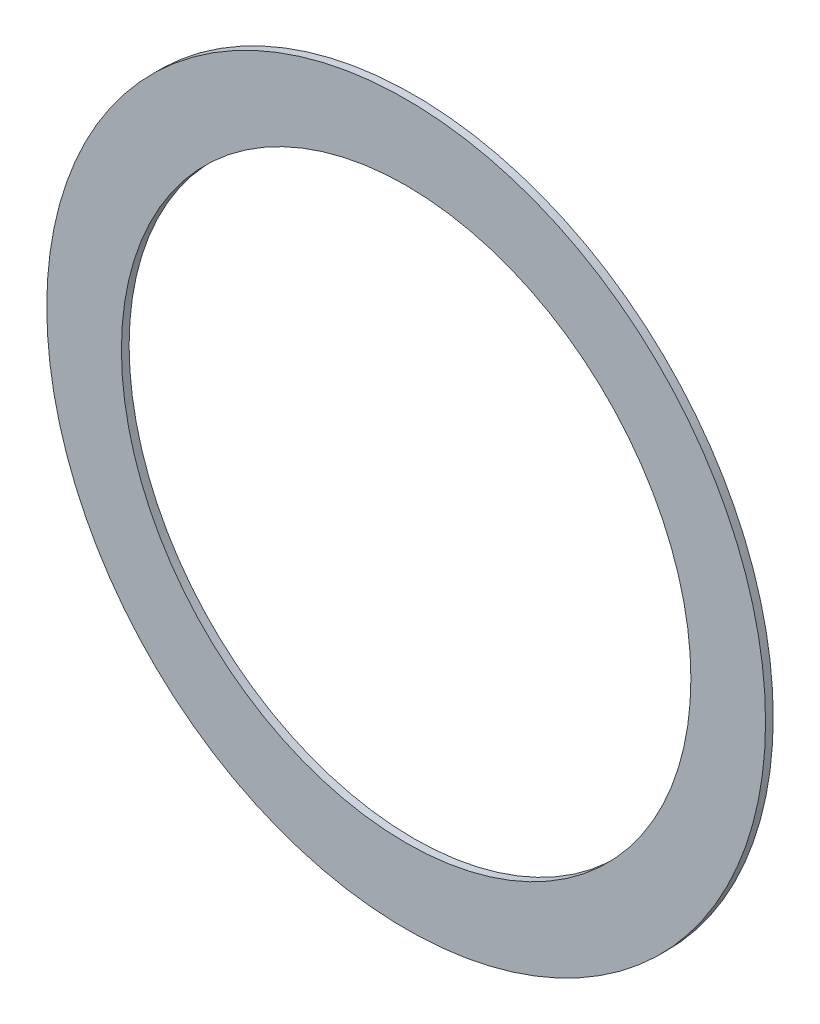
ISO-10303-21;
HEADER;
FILE_DESCRIPTION(('STEP AP214'),'2;1');
FILE_NAME('part.step','',(''),(''),'','','');
FILE_SCHEMA(('AUTOMOTIVE_DESIGN { 1 0 10303 214 1 1 1 1 }'));
ENDSEC;
DATA;
#1=APPLICATION_CONTEXT('core data for automotive mechanical design processes');
#2=APPLICATION_PROTOCOL_DEFINITION('international standard','automotive_design',2000,#1);
#3=PRODUCT_CONTEXT('',#1,'mechanical');
#4=PRODUCT('Part','Part','',(#3));
#5=PRODUCT_RELATED_PRODUCT_CATEGORY('part','',(#4));
#6=PRODUCT_DEFINITION_FORMATION('','',#4);
#7=PRODUCT_DEFINITION_CONTEXT('part definition',#1,'design');
#8=PRODUCT_DEFINITION('design','',#6,#7);
#9=PRODUCT_DEFINITION_SHAPE('','',#8);
#10=(LENGTH_UNIT() NAMED_UNIT(*) SI_UNIT(.MILLI.,.METRE.));
#11=(NAMED_UNIT(*) PLANE_ANGLE_UNIT() SI_UNIT($,.RADIAN.));
#12=(NAMED_UNIT(*) SI_UNIT($,.STERADIAN.) SOLID_ANGLE_UNIT());
#13=UNCERTAINTY_MEASURE_WITH_UNIT(LENGTH_MEASURE(1.E-05),#10,'distance_accuracy_value','');
#14=(GEOMETRIC_REPRESENTATION_CONTEXT(3) GLOBAL_UNCERTAINTY_ASSIGNED_CONTEXT((#13)) GLOBAL_UNIT_ASSIGNED_CONTEXT((#10,
#11,#12)) REPRESENTATION_CONTEXT('',''));
#15=CARTESIAN_POINT('',(0.,0.,0.));
#16=DIRECTION('',(0.,0.,1.));
#17=DIRECTION('',(1.,0.,0.));
#18=AXIS2_PLACEMENT_3D('',#15,#16,#17);
#19=CARTESIAN_POINT('',(0.,0.,0.5));
#20=DIRECTION('',(0.,0.,1.));
#21=DIRECTION('',(1.,0.,0.));
#22=AXIS2_PLACEMENT_3D('',#19,#20,#21);
#23=PLANE('',#22);
#24=CARTESIAN_POINT('',(0.,0.,0.5));
#25=DIRECTION('',(0.,0.,1.));
#26=DIRECTION('',(1.,0.,0.));
#27=AXIS2_PLACEMENT_3D('',#24,#25,#26);
#28=CIRCLE('',#27,23.35);
#29=CARTESIAN_POINT('',(23.35,0.,0.5));
#30=VERTEX_POINT('',#29);
#31=EDGE_CURVE('E10',#30,#30,#28,.T.);
#32=ORIENTED_EDGE('',*,*,#31,.T.);
#33=EDGE_LOOP('',(#32));
#34=FACE_BOUND('',#33,.T.);
#35=CARTESIAN_POINT('',(0.,0.,0.5));
#36=DIRECTION('',(0.,0.,1.));
#37=DIRECTION('',(1.,0.,0.));
#38=AXIS2_PLACEMENT_3D('',#35,#36,#37);
#39=CIRCLE('',#38,18.5);
#40=CARTESIAN_POINT('',(18.5,0.,0.5));
#41=VERTEX_POINT('',#40);
#42=EDGE_CURVE('E42',#41,#41,#39,.T.);
#43=ORIENTED_EDGE('',*,*,#42,.F.);
#44=EDGE_LOOP('',(#43));
#45=FACE_BOUND('',#44,.T.);
#46=ADVANCED_FACE('F31',(#34,#45),#23,.T.);
#47=CARTESIAN_POINT('',(0.,0.,0.));
#48=DIRECTION('',(0.,0.,1.));
#49=DIRECTION('',(1.,0.,0.));
#50=AXIS2_PLACEMENT_3D('',#47,#48,#49);
#51=PLANE('',#50);
#52=CARTESIAN_POINT('',(0.,0.,0.));
#53=DIRECTION('',(0.,0.,1.));
#54=DIRECTION('',(1.,0.,0.));
#55=AXIS2_PLACEMENT_3D('',#52,#53,#54);
#56=CIRCLE('',#55,23.35);
#57=CARTESIAN_POINT('',(23.35,0.,0.));
#58=VERTEX_POINT('',#57);
#59=EDGE_CURVE('E38',#58,#58,#56,.T.);
#60=ORIENTED_EDGE('',*,*,#59,.F.);
#61=EDGE_LOOP('',(#60));
#62=FACE_BOUND('',#61,.T.);
#63=CARTESIAN_POINT('',(0.,0.,0.));
#64=DIRECTION('',(0.,0.,1.));
#65=DIRECTION('',(1.,0.,0.));
#66=AXIS2_PLACEMENT_3D('',#63,#64,#65);
#67=CIRCLE('',#66,18.5);
#68=CARTESIAN_POINT('',(18.5,0.,0.));
#69=VERTEX_POINT('',#68);
#70=EDGE_CURVE('E46',#69,#69,#67,.T.);
#71=ORIENTED_EDGE('',*,*,#70,.T.);
#72=EDGE_LOOP('',(#71));
#73=FACE_BOUND('',#72,.T.);
#74=ADVANCED_FACE('F52',(#62,#73),#51,.F.);
#75=CARTESIAN_POINT('',(0.,0.,0.5));
#76=DIRECTION('',(0.,0.,-1.));
#77=DIRECTION('',(-1.,0.,0.));
#78=AXIS2_PLACEMENT_3D('',#75,#76,#77);
#79=CYLINDRICAL_SURFACE('',#78,23.35);
#80=ORIENTED_EDGE('',*,*,#31,.F.);
#81=EDGE_LOOP('',(#80));
#82=FACE_BOUND('',#81,.T.);
#83=ORIENTED_EDGE('',*,*,#59,.T.);
#84=EDGE_LOOP('',(#83));
#85=FACE_BOUND('',#84,.T.);
#86=ADVANCED_FACE('F33',(#82,#85),#79,.T.);
#87=CARTESIAN_POINT('',(0.,0.,0.5));
#88=DIRECTION('',(0.,0.,-1.));
#89=DIRECTION('',(-1.,0.,0.));
#90=AXIS2_PLACEMENT_3D('',#87,#88,#89);
#91=CYLINDRICAL_SURFACE('',#90,18.5);
#92=ORIENTED_EDGE('',*,*,#42,.T.);
#93=EDGE_LOOP('',(#92));
#94=FACE_BOUND('',#93,.T.);
#95=ORIENTED_EDGE('',*,*,#70,.F.);
#96=EDGE_LOOP('',(#95));
#97=FACE_BOUND('',#96,.T.);
#98=ADVANCED_FACE('F54',(#94,#97),#91,.F.);
#99=CLOSED_SHELL('',(#46,#74,#86,#98));
#100=MANIFOLD_SOLID_BREP('B2',#99);
#101=ADVANCED_BREP_SHAPE_REPRESENTATION('',(#18,#100),#14);
#102=SHAPE_DEFINITION_REPRESENTATION(#9,#101);
ENDSEC;
END-ISO-10303-21;
